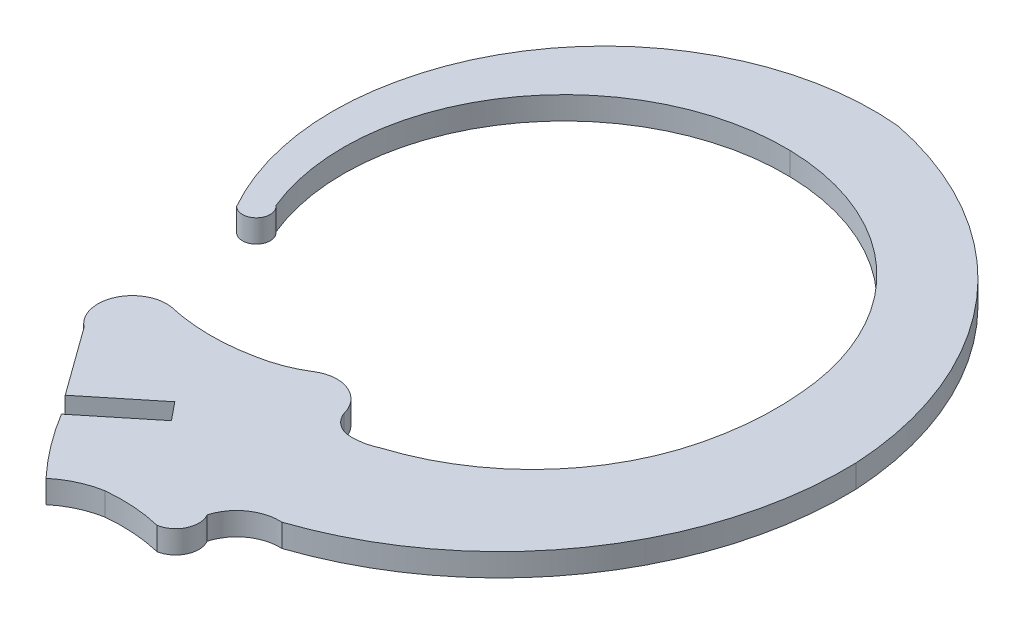
ISO-10303-21;
HEADER;
FILE_DESCRIPTION(('STEP AP214'),'2;1');
FILE_NAME('part.step','',(''),(''),'','','');
FILE_SCHEMA(('AUTOMOTIVE_DESIGN { 1 0 10303 214 1 1 1 1 }'));
ENDSEC;
DATA;
#1=APPLICATION_CONTEXT('core data for automotive mechanical design processes');
#2=APPLICATION_PROTOCOL_DEFINITION('international standard','automotive_design',2000,#1);
#3=PRODUCT_CONTEXT('',#1,'mechanical');
#4=PRODUCT('Part','Part','',(#3));
#5=PRODUCT_RELATED_PRODUCT_CATEGORY('part','',(#4));
#6=PRODUCT_DEFINITION_FORMATION('','',#4);
#7=PRODUCT_DEFINITION_CONTEXT('part definition',#1,'design');
#8=PRODUCT_DEFINITION('design','',#6,#7);
#9=PRODUCT_DEFINITION_SHAPE('','',#8);
#10=(LENGTH_UNIT() NAMED_UNIT(*) SI_UNIT(.MILLI.,.METRE.));
#11=(NAMED_UNIT(*) PLANE_ANGLE_UNIT() SI_UNIT($,.RADIAN.));
#12=(NAMED_UNIT(*) SI_UNIT($,.STERADIAN.) SOLID_ANGLE_UNIT());
#13=UNCERTAINTY_MEASURE_WITH_UNIT(LENGTH_MEASURE(1.E-05),#10,'distance_accuracy_value','');
#14=(GEOMETRIC_REPRESENTATION_CONTEXT(3) GLOBAL_UNCERTAINTY_ASSIGNED_CONTEXT((#13)) GLOBAL_UNIT_ASSIGNED_CONTEXT((#10,
#11,#12)) REPRESENTATION_CONTEXT('',''));
#15=CARTESIAN_POINT('',(0.,0.,0.));
#16=DIRECTION('',(0.,0.,1.));
#17=DIRECTION('',(1.,0.,0.));
#18=AXIS2_PLACEMENT_3D('',#15,#16,#17);
#19=CARTESIAN_POINT('',(141.3229,3.,-61.97529));
#20=DIRECTION('',(-0.63033432014643,0.,-0.776323801545165));
#21=DIRECTION('',(-0.776323801545166,0.,0.630334320146431));
#22=AXIS2_PLACEMENT_3D('',#19,#20,#21);
#23=PLANE('',#22);
#24=DIRECTION('',(0.776323801545165,0.,-0.63033432014643));
#25=VECTOR('',#24,1.);
#26=CARTESIAN_POINT('',(141.3229,0.,-61.97529));
#27=LINE('',#26,#25);
#28=CARTESIAN_POINT('',(133.37894,0.,-55.52521));
#29=VERTEX_POINT('',#28);
#30=CARTESIAN_POINT('',(141.3229,0.,-61.97529));
#31=VERTEX_POINT('',#30);
#32=EDGE_CURVE('E239',#29,#31,#27,.T.);
#33=ORIENTED_EDGE('',*,*,#32,.T.);
#34=DIRECTION('',(0.,-1.,0.));
#35=VECTOR('',#34,1.);
#36=CARTESIAN_POINT('',(141.3229,3.,-61.97529));
#37=LINE('',#36,#35);
#38=CARTESIAN_POINT('',(141.3229,3.,-61.97529));
#39=VERTEX_POINT('',#38);
#40=EDGE_CURVE('E11',#39,#31,#37,.T.);
#41=ORIENTED_EDGE('',*,*,#40,.F.);
#42=DIRECTION('',(0.776323801545165,0.,-0.63033432014643));
#43=VECTOR('',#42,1.);
#44=CARTESIAN_POINT('',(141.3229,3.,-61.97529));
#45=LINE('',#44,#43);
#46=CARTESIAN_POINT('',(133.37894,3.,-55.52521));
#47=VERTEX_POINT('',#46);
#48=EDGE_CURVE('E289',#47,#39,#45,.T.);
#49=ORIENTED_EDGE('',*,*,#48,.F.);
#50=DIRECTION('',(0.,-1.,0.));
#51=VECTOR('',#50,1.);
#52=CARTESIAN_POINT('',(133.37894,3.,-55.52521));
#53=LINE('',#52,#51);
#54=EDGE_CURVE('E235',#47,#29,#53,.T.);
#55=ORIENTED_EDGE('',*,*,#54,.T.);
#56=EDGE_LOOP('',(#33,#41,#49,#55));
#57=FACE_BOUND('',#56,.T.);
#58=ADVANCED_FACE('F35',(#57),#23,.F.);
#59=CARTESIAN_POINT('',(143.25429,3.,-59.59579));
#60=DIRECTION('',(0.776425907353547,0.,-0.630208545158046));
#61=DIRECTION('',(-0.630208545158046,0.,-0.776425907353547));
#62=AXIS2_PLACEMENT_3D('',#59,#60,#61);
#63=PLANE('',#62);
#64=DIRECTION('',(0.630208545158046,0.,0.776425907353547));
#65=VECTOR('',#64,1.);
#66=CARTESIAN_POINT('',(143.25429,0.,-59.59579));
#67=LINE('',#66,#65);
#68=CARTESIAN_POINT('',(143.25429,0.,-59.59579));
#69=VERTEX_POINT('',#68);
#70=EDGE_CURVE('E242',#31,#69,#67,.T.);
#71=ORIENTED_EDGE('',*,*,#70,.T.);
#72=DIRECTION('',(0.,-1.,0.));
#73=VECTOR('',#72,1.);
#74=CARTESIAN_POINT('',(143.25429,3.,-59.59579));
#75=LINE('',#74,#73);
#76=CARTESIAN_POINT('',(143.25429,3.,-59.59579));
#77=VERTEX_POINT('',#76);
#78=EDGE_CURVE('E43',#77,#69,#75,.T.);
#79=ORIENTED_EDGE('',*,*,#78,.F.);
#80=DIRECTION('',(0.630208545158046,0.,0.776425907353547));
#81=VECTOR('',#80,1.);
#82=CARTESIAN_POINT('',(143.25429,3.,-59.59579));
#83=LINE('',#82,#81);
#84=EDGE_CURVE('E148',#39,#77,#83,.T.);
#85=ORIENTED_EDGE('',*,*,#84,.F.);
#86=ORIENTED_EDGE('',*,*,#40,.T.);
#87=EDGE_LOOP('',(#71,#79,#85,#86));
#88=FACE_BOUND('',#87,.T.);
#89=ADVANCED_FACE('F437',(#88),#63,.F.);
#90=CARTESIAN_POINT('',(135.27973999998,3.,-53.1224799999469));
#91=DIRECTION('',(0.630239993947959,0.,0.77640037997703));
#92=DIRECTION('',(0.77640037997703,0.,-0.630239993947959));
#93=AXIS2_PLACEMENT_3D('',#90,#91,#92);
#94=PLANE('',#93);
#95=DIRECTION('',(-0.77640037997703,0.,0.630239993947959));
#96=VECTOR('',#95,1.);
#97=CARTESIAN_POINT('',(135.27973999998,0.,-53.1224799999469));
#98=LINE('',#97,#96);
#99=CARTESIAN_POINT('',(135.27973999998,0.,-53.1224799999469));
#100=VERTEX_POINT('',#99);
#101=EDGE_CURVE('E244',#69,#100,#98,.T.);
#102=ORIENTED_EDGE('',*,*,#101,.T.);
#103=DIRECTION('',(0.,-1.,0.));
#104=VECTOR('',#103,1.);
#105=CARTESIAN_POINT('',(135.27973999998,3.,-53.1224799999469));
#106=LINE('',#105,#104);
#107=CARTESIAN_POINT('',(135.27973999998,3.,-53.1224799999469));
#108=VERTEX_POINT('',#107);
#109=EDGE_CURVE('E350',#108,#100,#106,.T.);
#110=ORIENTED_EDGE('',*,*,#109,.F.);
#111=DIRECTION('',(-0.77640037997703,0.,0.630239993947959));
#112=VECTOR('',#111,1.);
#113=CARTESIAN_POINT('',(135.27973999998,3.,-53.1224799999469));
#114=LINE('',#113,#112);
#115=EDGE_CURVE('E358',#77,#108,#114,.T.);
#116=ORIENTED_EDGE('',*,*,#115,.F.);
#117=ORIENTED_EDGE('',*,*,#78,.T.);
#118=EDGE_LOOP('',(#102,#110,#116,#117));
#119=FACE_BOUND('',#118,.T.);
#120=ADVANCED_FACE('F356',(#119),#94,.F.);
#121=CARTESIAN_POINT('',(178.514744652899,3.,-79.297487066962));
#122=DIRECTION('',(0.,-1.,0.));
#123=DIRECTION('',(0.,0.,-1.));
#124=AXIS2_PLACEMENT_3D('',#121,#122,#123);
#125=CYLINDRICAL_SURFACE('',#124,50.5410389910634);
#126=CARTESIAN_POINT('',(178.514744652899,0.,-79.297487066962));
#127=DIRECTION('',(0.,1.,0.));
#128=DIRECTION('',(0.,0.,1.));
#129=AXIS2_PLACEMENT_3D('',#126,#127,#128);
#130=CIRCLE('',#129,50.5410389910634);
#131=CARTESIAN_POINT('',(141.571160000029,0.,-44.8073700000046));
#132=VERTEX_POINT('',#131);
#133=EDGE_CURVE('E246',#100,#132,#130,.T.);
#134=ORIENTED_EDGE('',*,*,#133,.T.);
#135=DIRECTION('',(0.,-1.,0.));
#136=VECTOR('',#135,1.);
#137=CARTESIAN_POINT('',(141.571160000029,3.,-44.8073700000046));
#138=LINE('',#137,#136);
#139=CARTESIAN_POINT('',(141.571160000029,3.,-44.8073700000046));
#140=VERTEX_POINT('',#139);
#141=EDGE_CURVE('E347',#140,#132,#138,.T.);
#142=ORIENTED_EDGE('',*,*,#141,.F.);
#143=CARTESIAN_POINT('',(178.514744652899,3.,-79.297487066962));
#144=DIRECTION('',(0.,1.,0.));
#145=DIRECTION('',(0.,0.,1.));
#146=AXIS2_PLACEMENT_3D('',#143,#144,#145);
#147=CIRCLE('',#146,50.5410389910634);
#148=EDGE_CURVE('E376',#108,#140,#147,.T.);
#149=ORIENTED_EDGE('',*,*,#148,.F.);
#150=ORIENTED_EDGE('',*,*,#109,.T.);
#151=EDGE_LOOP('',(#134,#142,#149,#150));
#152=FACE_BOUND('',#151,.T.);
#153=ADVANCED_FACE('F367',(#152),#125,.T.);
#154=CARTESIAN_POINT('',(148.778263669927,3.,-36.2116017067342));
#155=DIRECTION('',(0.,-1.,0.));
#156=DIRECTION('',(0.,0.,-1.));
#157=AXIS2_PLACEMENT_3D('',#154,#155,#156);
#158=CYLINDRICAL_SURFACE('',#157,11.2173782971);
#159=CARTESIAN_POINT('',(148.778263669927,0.,-36.2116017067342));
#160=DIRECTION('',(0.,-1.,0.));
#161=DIRECTION('',(0.,0.,1.));
#162=AXIS2_PLACEMENT_3D('',#159,#160,#161);
#163=CIRCLE('',#162,11.2173782971);
#164=CARTESIAN_POINT('',(146.848320000081,0.,-47.2617099999353));
#165=VERTEX_POINT('',#164);
#166=EDGE_CURVE('E248',#132,#165,#163,.T.);
#167=ORIENTED_EDGE('',*,*,#166,.T.);
#168=DIRECTION('',(0.,-1.,0.));
#169=VECTOR('',#168,1.);
#170=CARTESIAN_POINT('',(146.848320000081,3.,-47.2617099999353));
#171=LINE('',#170,#169);
#172=CARTESIAN_POINT('',(146.848320000081,3.,-47.2617099999353));
#173=VERTEX_POINT('',#172);
#174=EDGE_CURVE('E344',#173,#165,#171,.T.);
#175=ORIENTED_EDGE('',*,*,#174,.F.);
#176=CARTESIAN_POINT('',(148.778263669927,3.,-36.2116017067342));
#177=DIRECTION('',(0.,-1.,0.));
#178=DIRECTION('',(0.,0.,1.));
#179=AXIS2_PLACEMENT_3D('',#176,#177,#178);
#180=CIRCLE('',#179,11.2173782971);
#181=EDGE_CURVE('E373',#140,#173,#180,.T.);
#182=ORIENTED_EDGE('',*,*,#181,.F.);
#183=ORIENTED_EDGE('',*,*,#141,.T.);
#184=EDGE_LOOP('',(#167,#175,#182,#183));
#185=FACE_BOUND('',#184,.T.);
#186=ADVANCED_FACE('F371',(#185),#158,.F.);
#187=CARTESIAN_POINT('',(149.035695842551,3.,-25.4804409807381));
#188=DIRECTION('',(0.,-1.,0.));
#189=DIRECTION('',(0.,0.,-1.));
#190=AXIS2_PLACEMENT_3D('',#187,#188,#189);
#191=CYLINDRICAL_SURFACE('',#190,21.8908266898);
#192=CARTESIAN_POINT('',(149.035695842551,0.,-25.4804409807381));
#193=DIRECTION('',(0.,-1.,0.));
#194=DIRECTION('',(0.,0.,1.));
#195=AXIS2_PLACEMENT_3D('',#192,#193,#194);
#196=CIRCLE('',#195,21.8908266898);
#197=CARTESIAN_POINT('',(154.205630000007,0.,-46.7520199999466));
#198=VERTEX_POINT('',#197);
#199=EDGE_CURVE('E250',#165,#198,#196,.T.);
#200=ORIENTED_EDGE('',*,*,#199,.T.);
#201=DIRECTION('',(0.,-1.,0.));
#202=VECTOR('',#201,1.);
#203=CARTESIAN_POINT('',(154.205630000007,3.,-46.7520199999466));
#204=LINE('',#203,#202);
#205=CARTESIAN_POINT('',(154.205630000007,3.,-46.7520199999466));
#206=VERTEX_POINT('',#205);
#207=EDGE_CURVE('E341',#206,#198,#204,.T.);
#208=ORIENTED_EDGE('',*,*,#207,.F.);
#209=CARTESIAN_POINT('',(149.035695842551,3.,-25.4804409807381));
#210=DIRECTION('',(0.,-1.,0.));
#211=DIRECTION('',(0.,0.,1.));
#212=AXIS2_PLACEMENT_3D('',#209,#210,#211);
#213=CIRCLE('',#212,21.8908266898);
#214=EDGE_CURVE('E375',#173,#206,#213,.T.);
#215=ORIENTED_EDGE('',*,*,#214,.F.);
#216=ORIENTED_EDGE('',*,*,#174,.T.);
#217=EDGE_LOOP('',(#200,#208,#215,#216));
#218=FACE_BOUND('',#217,.T.);
#219=ADVANCED_FACE('F450',(#218),#191,.F.);
#220=CARTESIAN_POINT('',(153.675678134344,3.,-49.7399960232772));
#221=DIRECTION('',(0.,-1.,0.));
#222=DIRECTION('',(0.,0.,-1.));
#223=AXIS2_PLACEMENT_3D('',#220,#221,#222);
#224=CYLINDRICAL_SURFACE('',#223,3.03460865613962);
#225=CARTESIAN_POINT('',(153.675678134344,0.,-49.7399960232772));
#226=DIRECTION('',(0.,1.,0.));
#227=DIRECTION('',(0.,0.,1.));
#228=AXIS2_PLACEMENT_3D('',#225,#226,#227);
#229=CIRCLE('',#228,3.03460865613962);
#230=CARTESIAN_POINT('',(156.312290000013,0.,-51.2423699999325));
#231=VERTEX_POINT('',#230);
#232=EDGE_CURVE('E252',#198,#231,#229,.T.);
#233=ORIENTED_EDGE('',*,*,#232,.T.);
#234=DIRECTION('',(0.,-1.,0.));
#235=VECTOR('',#234,1.);
#236=CARTESIAN_POINT('',(156.312290000013,3.,-51.2423699999325));
#237=LINE('',#236,#235);
#238=CARTESIAN_POINT('',(156.312290000013,3.,-51.2423699999325));
#239=VERTEX_POINT('',#238);
#240=EDGE_CURVE('E338',#239,#231,#237,.T.);
#241=ORIENTED_EDGE('',*,*,#240,.F.);
#242=CARTESIAN_POINT('',(153.675678134344,3.,-49.7399960232772));
#243=DIRECTION('',(0.,1.,0.));
#244=DIRECTION('',(0.,0.,1.));
#245=AXIS2_PLACEMENT_3D('',#242,#243,#244);
#246=CIRCLE('',#245,3.03460865613962);
#247=EDGE_CURVE('E378',#206,#239,#246,.T.);
#248=ORIENTED_EDGE('',*,*,#247,.F.);
#249=ORIENTED_EDGE('',*,*,#207,.T.);
#250=EDGE_LOOP('',(#233,#241,#248,#249));
#251=FACE_BOUND('',#250,.T.);
#252=ADVANCED_FACE('F453',(#251),#224,.T.);
#253=CARTESIAN_POINT('',(161.740328152736,3.,-49.6722486888493));
#254=DIRECTION('',(0.,-1.,0.));
#255=DIRECTION('',(0.,0.,-1.));
#256=AXIS2_PLACEMENT_3D('',#253,#254,#255);
#257=CYLINDRICAL_SURFACE('',#256,5.6505644956);
#258=CARTESIAN_POINT('',(161.740328152736,0.,-49.6722486888493));
#259=DIRECTION('',(0.,-1.,0.));
#260=DIRECTION('',(0.,0.,1.));
#261=AXIS2_PLACEMENT_3D('',#258,#259,#260);
#262=CIRCLE('',#261,5.6505644956);
#263=CARTESIAN_POINT('',(162.049110000062,0.,-55.3143699999961));
#264=VERTEX_POINT('',#263);
#265=EDGE_CURVE('E254',#231,#264,#262,.T.);
#266=ORIENTED_EDGE('',*,*,#265,.T.);
#267=DIRECTION('',(0.,-1.,0.));
#268=VECTOR('',#267,1.);
#269=CARTESIAN_POINT('',(162.049110000062,3.,-55.3143699999961));
#270=LINE('',#269,#268);
#271=CARTESIAN_POINT('',(162.049110000062,3.,-55.3143699999961));
#272=VERTEX_POINT('',#271);
#273=EDGE_CURVE('E335',#272,#264,#270,.T.);
#274=ORIENTED_EDGE('',*,*,#273,.F.);
#275=CARTESIAN_POINT('',(161.740328152736,3.,-49.6722486888493));
#276=DIRECTION('',(0.,-1.,0.));
#277=DIRECTION('',(0.,0.,1.));
#278=AXIS2_PLACEMENT_3D('',#275,#276,#277);
#279=CIRCLE('',#278,5.6505644956);
#280=EDGE_CURVE('E384',#239,#272,#279,.T.);
#281=ORIENTED_EDGE('',*,*,#280,.F.);
#282=ORIENTED_EDGE('',*,*,#240,.T.);
#283=EDGE_LOOP('',(#266,#274,#281,#282));
#284=FACE_BOUND('',#283,.T.);
#285=ADVANCED_FACE('F457',(#284),#257,.F.);
#286=CARTESIAN_POINT('',(147.523516574409,3.,-98.4431050820576));
#287=DIRECTION('',(0.,-1.,0.));
#288=DIRECTION('',(0.,0.,-1.));
#289=AXIS2_PLACEMENT_3D('',#286,#287,#288);
#290=CYLINDRICAL_SURFACE('',#289,45.5091271521);
#291=CARTESIAN_POINT('',(147.523516574409,0.,-98.4431050820576));
#292=DIRECTION('',(0.,1.,0.));
#293=DIRECTION('',(0.,0.,1.));
#294=AXIS2_PLACEMENT_3D('',#291,#292,#293);
#295=CIRCLE('',#294,45.5091271521);
#296=CARTESIAN_POINT('',(193.013370000028,0.,-99.7674500000169));
#297=VERTEX_POINT('',#296);
#298=EDGE_CURVE('E256',#264,#297,#295,.T.);
#299=ORIENTED_EDGE('',*,*,#298,.T.);
#300=DIRECTION('',(0.,-1.,0.));
#301=VECTOR('',#300,1.);
#302=CARTESIAN_POINT('',(193.013370000028,3.,-99.7674500000169));
#303=LINE('',#302,#301);
#304=CARTESIAN_POINT('',(193.013370000028,3.,-99.7674500000169));
#305=VERTEX_POINT('',#304);
#306=EDGE_CURVE('E332',#305,#297,#303,.T.);
#307=ORIENTED_EDGE('',*,*,#306,.F.);
#308=CARTESIAN_POINT('',(147.523516574409,3.,-98.4431050820576));
#309=DIRECTION('',(0.,1.,0.));
#310=DIRECTION('',(0.,0.,1.));
#311=AXIS2_PLACEMENT_3D('',#308,#309,#310);
#312=CIRCLE('',#311,45.5091271521);
#313=EDGE_CURVE('E386',#272,#305,#312,.T.);
#314=ORIENTED_EDGE('',*,*,#313,.F.);
#315=ORIENTED_EDGE('',*,*,#273,.T.);
#316=EDGE_LOOP('',(#299,#307,#314,#315));
#317=FACE_BOUND('',#316,.T.);
#318=ADVANCED_FACE('F461',(#317),#290,.T.);
#319=CARTESIAN_POINT('',(148.693038754421,3.,-97.3202614375352));
#320=DIRECTION('',(0.,-1.,0.));
#321=DIRECTION('',(0.,0.,-1.));
#322=AXIS2_PLACEMENT_3D('',#319,#320,#321);
#323=CYLINDRICAL_SURFACE('',#322,44.3878417315);
#324=CARTESIAN_POINT('',(148.693038754421,0.,-97.3202614375352));
#325=DIRECTION('',(0.,1.,0.));
#326=DIRECTION('',(0.,0.,1.));
#327=AXIS2_PLACEMENT_3D('',#324,#325,#326);
#328=CIRCLE('',#327,44.3878417315);
#329=CARTESIAN_POINT('',(157.423129999921,0.,-140.841129999938));
#330=VERTEX_POINT('',#329);
#331=EDGE_CURVE('E258',#297,#330,#328,.T.);
#332=ORIENTED_EDGE('',*,*,#331,.T.);
#333=DIRECTION('',(0.,-1.,0.));
#334=VECTOR('',#333,1.);
#335=CARTESIAN_POINT('',(157.423129999921,3.,-140.841129999938));
#336=LINE('',#335,#334);
#337=CARTESIAN_POINT('',(157.423129999921,3.,-140.841129999938));
#338=VERTEX_POINT('',#337);
#339=EDGE_CURVE('E329',#338,#330,#336,.T.);
#340=ORIENTED_EDGE('',*,*,#339,.F.);
#341=CARTESIAN_POINT('',(148.693038754421,3.,-97.3202614375352));
#342=DIRECTION('',(0.,1.,0.));
#343=DIRECTION('',(0.,0.,1.));
#344=AXIS2_PLACEMENT_3D('',#341,#342,#343);
#345=CIRCLE('',#344,44.3878417315);
#346=EDGE_CURVE('E388',#305,#338,#345,.T.);
#347=ORIENTED_EDGE('',*,*,#346,.F.);
#348=ORIENTED_EDGE('',*,*,#306,.T.);
#349=EDGE_LOOP('',(#332,#340,#347,#348));
#350=FACE_BOUND('',#349,.T.);
#351=ADVANCED_FACE('F465',(#350),#323,.T.);
#352=CARTESIAN_POINT('',(154.076220227908,3.,-105.627310166853));
#353=DIRECTION('',(0.,-1.,0.));
#354=DIRECTION('',(0.,0.,-1.));
#355=AXIS2_PLACEMENT_3D('',#352,#353,#354);
#356=CYLINDRICAL_SURFACE('',#355,35.3725163405);
#357=CARTESIAN_POINT('',(154.076220227908,0.,-105.627310166853));
#358=DIRECTION('',(0.,1.,0.));
#359=DIRECTION('',(0.,0.,1.));
#360=AXIS2_PLACEMENT_3D('',#357,#358,#359);
#361=CIRCLE('',#360,35.3725163405);
#362=CARTESIAN_POINT('',(119.496370000009,0.,-113.073709999995));
#363=VERTEX_POINT('',#362);
#364=EDGE_CURVE('E260',#330,#363,#361,.T.);
#365=ORIENTED_EDGE('',*,*,#364,.T.);
#366=DIRECTION('',(0.,-1.,0.));
#367=VECTOR('',#366,1.);
#368=CARTESIAN_POINT('',(119.496370000009,3.,-113.073709999995));
#369=LINE('',#368,#367);
#370=CARTESIAN_POINT('',(119.496370000009,3.,-113.073709999995));
#371=VERTEX_POINT('',#370);
#372=EDGE_CURVE('E326',#371,#363,#369,.T.);
#373=ORIENTED_EDGE('',*,*,#372,.F.);
#374=CARTESIAN_POINT('',(154.076220227908,3.,-105.627310166853));
#375=DIRECTION('',(0.,1.,0.));
#376=DIRECTION('',(0.,0.,1.));
#377=AXIS2_PLACEMENT_3D('',#374,#375,#376);
#378=CIRCLE('',#377,35.3725163405);
#379=EDGE_CURVE('E390',#338,#371,#378,.T.);
#380=ORIENTED_EDGE('',*,*,#379,.F.);
#381=ORIENTED_EDGE('',*,*,#339,.T.);
#382=EDGE_LOOP('',(#365,#373,#380,#381));
#383=FACE_BOUND('',#382,.T.);
#384=ADVANCED_FACE('F469',(#383),#356,.T.);
#385=CARTESIAN_POINT('',(153.463000137854,3.,-105.405829064778));
#386=DIRECTION('',(0.,-1.,0.));
#387=DIRECTION('',(0.,0.,-1.));
#388=AXIS2_PLACEMENT_3D('',#385,#386,#387);
#389=CYLINDRICAL_SURFACE('',#388,34.8213779302);
#390=CARTESIAN_POINT('',(153.463000137854,0.,-105.405829064778));
#391=DIRECTION('',(0.,1.,0.));
#392=DIRECTION('',(0.,0.,1.));
#393=AXIS2_PLACEMENT_3D('',#390,#391,#392);
#394=CIRCLE('',#393,34.8213779302);
#395=CARTESIAN_POINT('',(123.152899999939,0.,-88.2644700000079));
#396=VERTEX_POINT('',#395);
#397=EDGE_CURVE('E262',#363,#396,#394,.T.);
#398=ORIENTED_EDGE('',*,*,#397,.T.);
#399=DIRECTION('',(0.,-1.,0.));
#400=VECTOR('',#399,1.);
#401=CARTESIAN_POINT('',(123.152899999939,3.,-88.2644700000079));
#402=LINE('',#401,#400);
#403=CARTESIAN_POINT('',(123.152899999939,3.,-88.2644700000079));
#404=VERTEX_POINT('',#403);
#405=EDGE_CURVE('E323',#404,#396,#402,.T.);
#406=ORIENTED_EDGE('',*,*,#405,.F.);
#407=CARTESIAN_POINT('',(153.463000137854,3.,-105.405829064778));
#408=DIRECTION('',(0.,1.,0.));
#409=DIRECTION('',(0.,0.,1.));
#410=AXIS2_PLACEMENT_3D('',#407,#408,#409);
#411=CIRCLE('',#410,34.8213779302);
#412=EDGE_CURVE('E392',#371,#404,#411,.T.);
#413=ORIENTED_EDGE('',*,*,#412,.F.);
#414=ORIENTED_EDGE('',*,*,#372,.T.);
#415=EDGE_LOOP('',(#398,#406,#413,#414));
#416=FACE_BOUND('',#415,.T.);
#417=ADVANCED_FACE('F473',(#416),#389,.T.);
#418=CARTESIAN_POINT('',(124.460105982563,3.,-89.541995717178));
#419=DIRECTION('',(0.,-1.,0.));
#420=DIRECTION('',(0.,0.,-1.));
#421=AXIS2_PLACEMENT_3D('',#418,#419,#420);
#422=CYLINDRICAL_SURFACE('',#421,1.82780180518522);
#423=CARTESIAN_POINT('',(124.460105982563,0.,-89.541995717178));
#424=DIRECTION('',(0.,1.,0.));
#425=DIRECTION('',(0.,0.,1.));
#426=AXIS2_PLACEMENT_3D('',#423,#424,#425);
#427=CIRCLE('',#426,1.82780180518522);
#428=CARTESIAN_POINT('',(125.651529999958,0.,-90.928129999927));
#429=VERTEX_POINT('',#428);
#430=EDGE_CURVE('E264',#396,#429,#427,.T.);
#431=ORIENTED_EDGE('',*,*,#430,.T.);
#432=DIRECTION('',(0.,-1.,0.));
#433=VECTOR('',#432,1.);
#434=CARTESIAN_POINT('',(125.651529999958,3.,-90.928129999927));
#435=LINE('',#434,#433);
#436=CARTESIAN_POINT('',(125.651529999958,3.,-90.928129999927));
#437=VERTEX_POINT('',#436);
#438=EDGE_CURVE('E320',#437,#429,#435,.T.);
#439=ORIENTED_EDGE('',*,*,#438,.F.);
#440=CARTESIAN_POINT('',(124.460105982563,3.,-89.541995717178));
#441=DIRECTION('',(0.,1.,0.));
#442=DIRECTION('',(0.,0.,1.));
#443=AXIS2_PLACEMENT_3D('',#440,#441,#442);
#444=CIRCLE('',#443,1.82780180518522);
#445=EDGE_CURVE('E394',#404,#437,#444,.T.);
#446=ORIENTED_EDGE('',*,*,#445,.F.);
#447=ORIENTED_EDGE('',*,*,#405,.T.);
#448=EDGE_LOOP('',(#431,#439,#446,#447));
#449=FACE_BOUND('',#448,.T.);
#450=ADVANCED_FACE('F477',(#449),#422,.T.);
#451=CARTESIAN_POINT('',(152.447452217334,3.,-101.981433225897));
#452=DIRECTION('',(0.,-1.,0.));
#453=DIRECTION('',(0.,0.,-1.));
#454=AXIS2_PLACEMENT_3D('',#451,#452,#453);
#455=CYLINDRICAL_SURFACE('',#454,28.9861511706);
#456=CARTESIAN_POINT('',(152.447452217334,0.,-101.981433225897));
#457=DIRECTION('',(0.,-1.,0.));
#458=DIRECTION('',(0.,0.,1.));
#459=AXIS2_PLACEMENT_3D('',#456,#457,#458);
#460=CIRCLE('',#459,28.9861511706);
#461=CARTESIAN_POINT('',(153.165469999998,0.,-130.958689999937));
#462=VERTEX_POINT('',#461);
#463=EDGE_CURVE('E266',#429,#462,#460,.T.);
#464=ORIENTED_EDGE('',*,*,#463,.T.);
#465=DIRECTION('',(0.,-1.,0.));
#466=VECTOR('',#465,1.);
#467=CARTESIAN_POINT('',(153.165469999998,3.,-130.958689999937));
#468=LINE('',#467,#466);
#469=CARTESIAN_POINT('',(153.165469999998,3.,-130.958689999937));
#470=VERTEX_POINT('',#469);
#471=EDGE_CURVE('E317',#470,#462,#468,.T.);
#472=ORIENTED_EDGE('',*,*,#471,.F.);
#473=CARTESIAN_POINT('',(152.447452217334,3.,-101.981433225897));
#474=DIRECTION('',(0.,-1.,0.));
#475=DIRECTION('',(0.,0.,1.));
#476=AXIS2_PLACEMENT_3D('',#473,#474,#475);
#477=CIRCLE('',#476,28.9861511706);
#478=EDGE_CURVE('E396',#437,#470,#477,.T.);
#479=ORIENTED_EDGE('',*,*,#478,.F.);
#480=ORIENTED_EDGE('',*,*,#438,.T.);
#481=EDGE_LOOP('',(#464,#472,#479,#480));
#482=FACE_BOUND('',#481,.T.);
#483=ADVANCED_FACE('F481',(#482),#455,.F.);
#484=CARTESIAN_POINT('',(152.588398020329,3.,-102.092021088258));
#485=DIRECTION('',(0.,-1.,0.));
#486=DIRECTION('',(0.,0.,-1.));
#487=AXIS2_PLACEMENT_3D('',#484,#485,#486);
#488=CYLINDRICAL_SURFACE('',#487,28.8724364425);
#489=CARTESIAN_POINT('',(152.588398020329,0.,-102.092021088258));
#490=DIRECTION('',(0.,-1.,0.));
#491=DIRECTION('',(0.,0.,1.));
#492=AXIS2_PLACEMENT_3D('',#489,#490,#491);
#493=CIRCLE('',#492,28.8724364425);
#494=CARTESIAN_POINT('',(176.651740000047,0.,-118.047369999935));
#495=VERTEX_POINT('',#494);
#496=EDGE_CURVE('E268',#462,#495,#493,.T.);
#497=ORIENTED_EDGE('',*,*,#496,.T.);
#498=DIRECTION('',(0.,-1.,0.));
#499=VECTOR('',#498,1.);
#500=CARTESIAN_POINT('',(176.651740000047,3.,-118.047369999935));
#501=LINE('',#500,#499);
#502=CARTESIAN_POINT('',(176.651740000047,3.,-118.047369999935));
#503=VERTEX_POINT('',#502);
#504=EDGE_CURVE('E314',#503,#495,#501,.T.);
#505=ORIENTED_EDGE('',*,*,#504,.F.);
#506=CARTESIAN_POINT('',(152.588398020329,3.,-102.092021088258));
#507=DIRECTION('',(0.,-1.,0.));
#508=DIRECTION('',(0.,0.,1.));
#509=AXIS2_PLACEMENT_3D('',#506,#507,#508);
#510=CIRCLE('',#509,28.8724364425);
#511=EDGE_CURVE('E398',#470,#503,#510,.T.);
#512=ORIENTED_EDGE('',*,*,#511,.F.);
#513=ORIENTED_EDGE('',*,*,#471,.T.);
#514=EDGE_LOOP('',(#497,#505,#512,#513));
#515=FACE_BOUND('',#514,.T.);
#516=ADVANCED_FACE('F485',(#515),#488,.F.);
#517=CARTESIAN_POINT('',(152.047707507843,3.,-101.842557270158));
#518=DIRECTION('',(0.,-1.,0.));
#519=DIRECTION('',(0.,0.,-1.));
#520=AXIS2_PLACEMENT_3D('',#517,#518,#519);
#521=CYLINDRICAL_SURFACE('',#520,29.4610653318);
#522=CARTESIAN_POINT('',(152.047707507843,0.,-101.842557270158));
#523=DIRECTION('',(0.,-1.,0.));
#524=DIRECTION('',(0.,0.,1.));
#525=AXIS2_PLACEMENT_3D('',#522,#523,#524);
#526=CIRCLE('',#525,29.4610653318);
#527=CARTESIAN_POINT('',(181.419049999986,0.,-104.140079999931));
#528=VERTEX_POINT('',#527);
#529=EDGE_CURVE('E270',#495,#528,#526,.T.);
#530=ORIENTED_EDGE('',*,*,#529,.T.);
#531=DIRECTION('',(0.,-1.,0.));
#532=VECTOR('',#531,1.);
#533=CARTESIAN_POINT('',(181.419049999986,3.,-104.140079999931));
#534=LINE('',#533,#532);
#535=CARTESIAN_POINT('',(181.419049999986,3.,-104.140079999931));
#536=VERTEX_POINT('',#535);
#537=EDGE_CURVE('E311',#536,#528,#534,.T.);
#538=ORIENTED_EDGE('',*,*,#537,.F.);
#539=CARTESIAN_POINT('',(152.047707507843,3.,-101.842557270158));
#540=DIRECTION('',(0.,-1.,0.));
#541=DIRECTION('',(0.,0.,1.));
#542=AXIS2_PLACEMENT_3D('',#539,#540,#541);
#543=CIRCLE('',#542,29.4610653318);
#544=EDGE_CURVE('E400',#503,#536,#543,.T.);
#545=ORIENTED_EDGE('',*,*,#544,.F.);
#546=ORIENTED_EDGE('',*,*,#504,.T.);
#547=EDGE_LOOP('',(#530,#538,#545,#546));
#548=FACE_BOUND('',#547,.T.);
#549=ADVANCED_FACE('F489',(#548),#521,.F.);
#550=CARTESIAN_POINT('',(145.201600302232,3.,-100.68502285411));
#551=DIRECTION('',(0.,-1.,0.));
#552=DIRECTION('',(0.,0.,-1.));
#553=AXIS2_PLACEMENT_3D('',#550,#551,#552);
#554=CYLINDRICAL_SURFACE('',#553,36.3818784904);
#555=CARTESIAN_POINT('',(145.201600302232,0.,-100.68502285411));
#556=DIRECTION('',(0.,-1.,0.));
#557=DIRECTION('',(0.,0.,1.));
#558=AXIS2_PLACEMENT_3D('',#555,#556,#557);
#559=CIRCLE('',#558,36.3818784904);
#560=CARTESIAN_POINT('',(179.892730000062,0.,-89.7229699998953));
#561=VERTEX_POINT('',#560);
#562=EDGE_CURVE('E272',#528,#561,#559,.T.);
#563=ORIENTED_EDGE('',*,*,#562,.T.);
#564=DIRECTION('',(0.,-1.,0.));
#565=VECTOR('',#564,1.);
#566=CARTESIAN_POINT('',(179.892730000062,3.,-89.7229699998953));
#567=LINE('',#566,#565);
#568=CARTESIAN_POINT('',(179.892730000062,3.,-89.7229699998953));
#569=VERTEX_POINT('',#568);
#570=EDGE_CURVE('E308',#569,#561,#567,.T.);
#571=ORIENTED_EDGE('',*,*,#570,.F.);
#572=CARTESIAN_POINT('',(145.201600302232,3.,-100.68502285411));
#573=DIRECTION('',(0.,-1.,0.));
#574=DIRECTION('',(0.,0.,1.));
#575=AXIS2_PLACEMENT_3D('',#572,#573,#574);
#576=CIRCLE('',#575,36.3818784904);
#577=EDGE_CURVE('E402',#536,#569,#576,.T.);
#578=ORIENTED_EDGE('',*,*,#577,.F.);
#579=ORIENTED_EDGE('',*,*,#537,.T.);
#580=EDGE_LOOP('',(#563,#571,#578,#579));
#581=FACE_BOUND('',#580,.T.);
#582=ADVANCED_FACE('F493',(#581),#554,.F.);
#583=CARTESIAN_POINT('',(151.011607179655,3.,-99.2663472228991));
#584=DIRECTION('',(0.,-1.,0.));
#585=DIRECTION('',(0.,0.,-1.));
#586=AXIS2_PLACEMENT_3D('',#583,#584,#585);
#587=CYLINDRICAL_SURFACE('',#586,30.4170232631);
#588=CARTESIAN_POINT('',(151.011607179655,0.,-99.2663472228991));
#589=DIRECTION('',(0.,-1.,0.));
#590=DIRECTION('',(0.,0.,1.));
#591=AXIS2_PLACEMENT_3D('',#588,#589,#590);
#592=CIRCLE('',#591,30.4170232631);
#593=CARTESIAN_POINT('',(160.107419999967,0.,-70.2411599999748));
#594=VERTEX_POINT('',#593);
#595=EDGE_CURVE('E274',#561,#594,#592,.T.);
#596=ORIENTED_EDGE('',*,*,#595,.T.);
#597=DIRECTION('',(0.,-1.,0.));
#598=VECTOR('',#597,1.);
#599=CARTESIAN_POINT('',(160.107419999967,3.,-70.2411599999748));
#600=LINE('',#599,#598);
#601=CARTESIAN_POINT('',(160.107419999967,3.,-70.2411599999748));
#602=VERTEX_POINT('',#601);
#603=EDGE_CURVE('E305',#602,#594,#600,.T.);
#604=ORIENTED_EDGE('',*,*,#603,.F.);
#605=CARTESIAN_POINT('',(151.011607179655,3.,-99.2663472228991));
#606=DIRECTION('',(0.,-1.,0.));
#607=DIRECTION('',(0.,0.,1.));
#608=AXIS2_PLACEMENT_3D('',#605,#606,#607);
#609=CIRCLE('',#608,30.4170232631);
#610=EDGE_CURVE('E404',#569,#602,#609,.T.);
#611=ORIENTED_EDGE('',*,*,#610,.F.);
#612=ORIENTED_EDGE('',*,*,#570,.T.);
#613=EDGE_LOOP('',(#596,#604,#611,#612));
#614=FACE_BOUND('',#613,.T.);
#615=ADVANCED_FACE('F497',(#614),#587,.F.);
#616=CARTESIAN_POINT('',(157.07452417409,3.,-76.5756890761018));
#617=DIRECTION('',(0.,-1.,0.));
#618=DIRECTION('',(0.,0.,-1.));
#619=AXIS2_PLACEMENT_3D('',#616,#617,#618);
#620=CYLINDRICAL_SURFACE('',#619,7.02315568009999);
#621=CARTESIAN_POINT('',(157.07452417409,0.,-76.5756890761018));
#622=DIRECTION('',(0.,-1.,0.));
#623=DIRECTION('',(0.,0.,1.));
#624=AXIS2_PLACEMENT_3D('',#621,#622,#623);
#625=CIRCLE('',#624,7.02315568009999);
#626=CARTESIAN_POINT('',(156.150159999974,0.,-69.6136299998995));
#627=VERTEX_POINT('',#626);
#628=EDGE_CURVE('E276',#594,#627,#625,.T.);
#629=ORIENTED_EDGE('',*,*,#628,.T.);
#630=DIRECTION('',(0.,-1.,0.));
#631=VECTOR('',#630,1.);
#632=CARTESIAN_POINT('',(156.150159999974,3.,-69.6136299998995));
#633=LINE('',#632,#631);
#634=CARTESIAN_POINT('',(156.150159999974,3.,-69.6136299998995));
#635=VERTEX_POINT('',#634);
#636=EDGE_CURVE('E302',#635,#627,#633,.T.);
#637=ORIENTED_EDGE('',*,*,#636,.F.);
#638=CARTESIAN_POINT('',(157.07452417409,3.,-76.5756890761018));
#639=DIRECTION('',(0.,-1.,0.));
#640=DIRECTION('',(0.,0.,1.));
#641=AXIS2_PLACEMENT_3D('',#638,#639,#640);
#642=CIRCLE('',#641,7.02315568009999);
#643=EDGE_CURVE('E406',#602,#635,#642,.T.);
#644=ORIENTED_EDGE('',*,*,#643,.F.);
#645=ORIENTED_EDGE('',*,*,#603,.T.);
#646=EDGE_LOOP('',(#629,#637,#644,#645));
#647=FACE_BOUND('',#646,.T.);
#648=ADVANCED_FACE('F501',(#647),#620,.F.);
#649=CARTESIAN_POINT('',(157.023568419481,3.,-72.9985614295398));
#650=DIRECTION('',(0.,-1.,0.));
#651=DIRECTION('',(0.,0.,-1.));
#652=AXIS2_PLACEMENT_3D('',#649,#650,#651);
#653=CYLINDRICAL_SURFACE('',#652,3.4957979133);
#654=CARTESIAN_POINT('',(157.023568419481,0.,-72.9985614295398));
#655=DIRECTION('',(0.,-1.,0.));
#656=DIRECTION('',(0.,0.,1.));
#657=AXIS2_PLACEMENT_3D('',#654,#655,#656);
#658=CIRCLE('',#657,3.4957979133);
#659=CARTESIAN_POINT('',(153.742970000013,0.,-71.7909699999509));
#660=VERTEX_POINT('',#659);
#661=EDGE_CURVE('E278',#627,#660,#658,.T.);
#662=ORIENTED_EDGE('',*,*,#661,.T.);
#663=DIRECTION('',(0.,-1.,0.));
#664=VECTOR('',#663,1.);
#665=CARTESIAN_POINT('',(153.742970000013,3.,-71.7909699999509));
#666=LINE('',#665,#664);
#667=CARTESIAN_POINT('',(153.742970000013,3.,-71.7909699999509));
#668=VERTEX_POINT('',#667);
#669=EDGE_CURVE('E299',#668,#660,#666,.T.);
#670=ORIENTED_EDGE('',*,*,#669,.F.);
#671=CARTESIAN_POINT('',(157.023568419481,3.,-72.9985614295398));
#672=DIRECTION('',(0.,-1.,0.));
#673=DIRECTION('',(0.,0.,1.));
#674=AXIS2_PLACEMENT_3D('',#671,#672,#673);
#675=CIRCLE('',#674,3.4957979133);
#676=EDGE_CURVE('E408',#635,#668,#675,.T.);
#677=ORIENTED_EDGE('',*,*,#676,.F.);
#678=ORIENTED_EDGE('',*,*,#636,.T.);
#679=EDGE_LOOP('',(#662,#670,#677,#678));
#680=FACE_BOUND('',#679,.T.);
#681=ADVANCED_FACE('F505',(#680),#653,.F.);
#682=CARTESIAN_POINT('',(149.328848250208,3.,-70.6687015951585));
#683=DIRECTION('',(0.,-1.,0.));
#684=DIRECTION('',(0.,0.,-1.));
#685=AXIS2_PLACEMENT_3D('',#682,#683,#684);
#686=CYLINDRICAL_SURFACE('',#685,4.55455345720001);
#687=CARTESIAN_POINT('',(149.328848250208,0.,-70.6687015951585));
#688=DIRECTION('',(0.,1.,0.));
#689=DIRECTION('',(0.,0.,1.));
#690=AXIS2_PLACEMENT_3D('',#687,#688,#689);
#691=CIRCLE('',#690,4.55455345720001);
#692=CARTESIAN_POINT('',(150.03931999998,0.,-75.1674999999849));
#693=VERTEX_POINT('',#692);
#694=EDGE_CURVE('E280',#660,#693,#691,.T.);
#695=ORIENTED_EDGE('',*,*,#694,.T.);
#696=DIRECTION('',(0.,-1.,0.));
#697=VECTOR('',#696,1.);
#698=CARTESIAN_POINT('',(150.03931999998,3.,-75.1674999999849));
#699=LINE('',#698,#697);
#700=CARTESIAN_POINT('',(150.03931999998,3.,-75.1674999999849));
#701=VERTEX_POINT('',#700);
#702=EDGE_CURVE('E296',#701,#693,#699,.T.);
#703=ORIENTED_EDGE('',*,*,#702,.F.);
#704=CARTESIAN_POINT('',(149.328848250208,3.,-70.6687015951585));
#705=DIRECTION('',(0.,1.,0.));
#706=DIRECTION('',(0.,0.,1.));
#707=AXIS2_PLACEMENT_3D('',#704,#705,#706);
#708=CIRCLE('',#707,4.55455345720001);
#709=EDGE_CURVE('E410',#668,#701,#708,.T.);
#710=ORIENTED_EDGE('',*,*,#709,.F.);
#711=ORIENTED_EDGE('',*,*,#669,.T.);
#712=EDGE_LOOP('',(#695,#703,#710,#711));
#713=FACE_BOUND('',#712,.T.);
#714=ADVANCED_FACE('F509',(#713),#686,.T.);
#715=CARTESIAN_POINT('',(149.401873340941,3.,-70.802610683399));
#716=DIRECTION('',(0.,-1.,0.));
#717=DIRECTION('',(0.,0.,-1.));
#718=AXIS2_PLACEMENT_3D('',#715,#716,#717);
#719=CYLINDRICAL_SURFACE('',#718,4.41118997427745);
#720=CARTESIAN_POINT('',(149.401873340941,0.,-70.802610683399));
#721=DIRECTION('',(0.,1.,0.));
#722=DIRECTION('',(0.,0.,1.));
#723=AXIS2_PLACEMENT_3D('',#720,#721,#722);
#724=CIRCLE('',#723,4.41118997427745);
#725=CARTESIAN_POINT('',(147.101660000032,0.,-74.5665999999977));
#726=VERTEX_POINT('',#725);
#727=EDGE_CURVE('E282',#693,#726,#724,.T.);
#728=ORIENTED_EDGE('',*,*,#727,.T.);
#729=DIRECTION('',(0.,-1.,0.));
#730=VECTOR('',#729,1.);
#731=CARTESIAN_POINT('',(147.101660000032,3.,-74.5665999999977));
#732=LINE('',#731,#730);
#733=CARTESIAN_POINT('',(147.101660000032,3.,-74.5665999999977));
#734=VERTEX_POINT('',#733);
#735=EDGE_CURVE('E293',#734,#726,#732,.T.);
#736=ORIENTED_EDGE('',*,*,#735,.F.);
#737=CARTESIAN_POINT('',(149.401873340941,3.,-70.802610683399));
#738=DIRECTION('',(0.,1.,0.));
#739=DIRECTION('',(0.,0.,1.));
#740=AXIS2_PLACEMENT_3D('',#737,#738,#739);
#741=CIRCLE('',#740,4.41118997427745);
#742=EDGE_CURVE('E412',#701,#734,#741,.T.);
#743=ORIENTED_EDGE('',*,*,#742,.F.);
#744=ORIENTED_EDGE('',*,*,#702,.T.);
#745=EDGE_LOOP('',(#728,#736,#743,#744));
#746=FACE_BOUND('',#745,.T.);
#747=ADVANCED_FACE('F418',(#746),#719,.T.);
#748=CARTESIAN_POINT('',(138.80457592312,3.,-87.7743522842125));
#749=DIRECTION('',(0.,-1.,0.));
#750=DIRECTION('',(0.,0.,-1.));
#751=AXIS2_PLACEMENT_3D('',#748,#749,#750);
#752=CYLINDRICAL_SURFACE('',#751,15.5976384296);
#753=CARTESIAN_POINT('',(138.80457592312,0.,-87.7743522842125));
#754=DIRECTION('',(0.,-1.,0.));
#755=DIRECTION('',(0.,0.,1.));
#756=AXIS2_PLACEMENT_3D('',#753,#754,#755);
#757=CIRCLE('',#756,15.5976384296);
#758=CARTESIAN_POINT('',(141.524129999993,0.,-72.4156300000022));
#759=VERTEX_POINT('',#758);
#760=EDGE_CURVE('E284',#726,#759,#757,.T.);
#761=ORIENTED_EDGE('',*,*,#760,.T.);
#762=DIRECTION('',(0.,-1.,0.));
#763=VECTOR('',#762,1.);
#764=CARTESIAN_POINT('',(141.524129999993,3.,-72.4156300000022));
#765=LINE('',#764,#763);
#766=CARTESIAN_POINT('',(141.524129999993,3.,-72.4156300000022));
#767=VERTEX_POINT('',#766);
#768=EDGE_CURVE('E230',#767,#759,#765,.T.);
#769=ORIENTED_EDGE('',*,*,#768,.F.);
#770=CARTESIAN_POINT('',(138.80457592312,3.,-87.7743522842125));
#771=DIRECTION('',(0.,-1.,0.));
#772=DIRECTION('',(0.,0.,1.));
#773=AXIS2_PLACEMENT_3D('',#770,#771,#772);
#774=CIRCLE('',#773,15.5976384296);
#775=EDGE_CURVE('E221',#734,#767,#774,.T.);
#776=ORIENTED_EDGE('',*,*,#775,.F.);
#777=ORIENTED_EDGE('',*,*,#735,.T.);
#778=EDGE_LOOP('',(#761,#769,#776,#777));
#779=FACE_BOUND('',#778,.T.);
#780=ADVANCED_FACE('F422',(#779),#752,.F.);
#781=CARTESIAN_POINT('',(136.164457192226,3.,-97.8059800343267));
#782=DIRECTION('',(0.,-1.,0.));
#783=DIRECTION('',(0.,0.,-1.));
#784=AXIS2_PLACEMENT_3D('',#781,#782,#783);
#785=CYLINDRICAL_SURFACE('',#784,25.9498741321);
#786=CARTESIAN_POINT('',(136.164457192226,0.,-97.8059800343267));
#787=DIRECTION('',(0.,-1.,0.));
#788=DIRECTION('',(0.,0.,1.));
#789=AXIS2_PLACEMENT_3D('',#786,#787,#788);
#790=CIRCLE('',#789,25.9498741321);
#791=CARTESIAN_POINT('',(130.186160000015,0.,-72.5541300000534));
#792=VERTEX_POINT('',#791);
#793=EDGE_CURVE('E229',#759,#792,#790,.T.);
#794=ORIENTED_EDGE('',*,*,#793,.T.);
#795=DIRECTION('',(0.,-1.,0.));
#796=VECTOR('',#795,1.);
#797=CARTESIAN_POINT('',(130.186160000015,3.,-72.5541300000534));
#798=LINE('',#797,#796);
#799=CARTESIAN_POINT('',(130.186160000015,3.,-72.5541300000534));
#800=VERTEX_POINT('',#799);
#801=EDGE_CURVE('E226',#800,#792,#798,.T.);
#802=ORIENTED_EDGE('',*,*,#801,.F.);
#803=CARTESIAN_POINT('',(136.164457192226,3.,-97.8059800343267));
#804=DIRECTION('',(0.,-1.,0.));
#805=DIRECTION('',(0.,0.,1.));
#806=AXIS2_PLACEMENT_3D('',#803,#804,#805);
#807=CIRCLE('',#806,25.9498741321);
#808=EDGE_CURVE('E215',#767,#800,#807,.T.);
#809=ORIENTED_EDGE('',*,*,#808,.F.);
#810=ORIENTED_EDGE('',*,*,#768,.T.);
#811=EDGE_LOOP('',(#794,#802,#809,#810));
#812=FACE_BOUND('',#811,.T.);
#813=ADVANCED_FACE('F227',(#812),#785,.F.);
#814=CARTESIAN_POINT('',(129.6515306586,3.,-68.065311619));
#815=DIRECTION('',(0.,-1.,0.));
#816=DIRECTION('',(0.,0.,-1.));
#817=AXIS2_PLACEMENT_3D('',#814,#815,#816);
#818=CYLINDRICAL_SURFACE('',#817,4.52054410340001);
#819=CARTESIAN_POINT('',(129.6515306586,0.,-68.065311619));
#820=DIRECTION('',(0.,1.,0.));
#821=DIRECTION('',(0.,0.,1.));
#822=AXIS2_PLACEMENT_3D('',#819,#820,#821);
#823=CIRCLE('',#822,4.52054410340001);
#824=CARTESIAN_POINT('',(126.900839999991,0.,-64.4779699999976));
#825=VERTEX_POINT('',#824);
#826=EDGE_CURVE('E134',#792,#825,#823,.T.);
#827=ORIENTED_EDGE('',*,*,#826,.T.);
#828=DIRECTION('',(0.,-1.,0.));
#829=VECTOR('',#828,1.);
#830=CARTESIAN_POINT('',(126.900839999991,3.,-64.4779699999976));
#831=LINE('',#830,#829);
#832=CARTESIAN_POINT('',(126.900839999991,3.,-64.4779699999976));
#833=VERTEX_POINT('',#832);
#834=EDGE_CURVE('E231',#833,#825,#831,.T.);
#835=ORIENTED_EDGE('',*,*,#834,.F.);
#836=CARTESIAN_POINT('',(129.6515306586,3.,-68.065311619));
#837=DIRECTION('',(0.,1.,0.));
#838=DIRECTION('',(0.,0.,1.));
#839=AXIS2_PLACEMENT_3D('',#836,#837,#838);
#840=CIRCLE('',#839,4.52054410340001);
#841=EDGE_CURVE('E219',#800,#833,#840,.T.);
#842=ORIENTED_EDGE('',*,*,#841,.F.);
#843=ORIENTED_EDGE('',*,*,#801,.T.);
#844=EDGE_LOOP('',(#827,#835,#842,#843));
#845=FACE_BOUND('',#844,.T.);
#846=ADVANCED_FACE('F233',(#845),#818,.T.);
#847=CARTESIAN_POINT('',(133.37894,3.,-55.52521));
#848=DIRECTION('',(0.810154129304861,0.,-0.586216928082329));
#849=DIRECTION('',(-0.586216928082329,0.,-0.810154129304861));
#850=AXIS2_PLACEMENT_3D('',#847,#848,#849);
#851=PLANE('',#850);
#852=DIRECTION('',(0.586216928082329,0.,0.810154129304861));
#853=VECTOR('',#852,1.);
#854=CARTESIAN_POINT('',(133.37894,0.,-55.52521));
#855=LINE('',#854,#853);
#856=EDGE_CURVE('E140',#825,#29,#855,.T.);
#857=ORIENTED_EDGE('',*,*,#856,.T.);
#858=ORIENTED_EDGE('',*,*,#54,.F.);
#859=DIRECTION('',(0.586216928082329,0.,0.810154129304861));
#860=VECTOR('',#859,1.);
#861=CARTESIAN_POINT('',(133.37894,3.,-55.52521));
#862=LINE('',#861,#860);
#863=EDGE_CURVE('E51',#833,#47,#862,.T.);
#864=ORIENTED_EDGE('',*,*,#863,.F.);
#865=ORIENTED_EDGE('',*,*,#834,.T.);
#866=EDGE_LOOP('',(#857,#858,#864,#865));
#867=FACE_BOUND('',#866,.T.);
#868=ADVANCED_FACE('F426',(#867),#851,.F.);
#869=CARTESIAN_POINT('',(129.6515306586,3.,-68.065311619));
#870=DIRECTION('',(0.,1.,0.));
#871=DIRECTION('',(0.,0.,1.));
#872=AXIS2_PLACEMENT_3D('',#869,#870,#871);
#873=PLANE('',#872);
#874=ORIENTED_EDGE('',*,*,#48,.T.);
#875=ORIENTED_EDGE('',*,*,#84,.T.);
#876=ORIENTED_EDGE('',*,*,#115,.T.);
#877=ORIENTED_EDGE('',*,*,#148,.T.);
#878=ORIENTED_EDGE('',*,*,#181,.T.);
#879=ORIENTED_EDGE('',*,*,#214,.T.);
#880=ORIENTED_EDGE('',*,*,#247,.T.);
#881=ORIENTED_EDGE('',*,*,#280,.T.);
#882=ORIENTED_EDGE('',*,*,#313,.T.);
#883=ORIENTED_EDGE('',*,*,#346,.T.);
#884=ORIENTED_EDGE('',*,*,#379,.T.);
#885=ORIENTED_EDGE('',*,*,#412,.T.);
#886=ORIENTED_EDGE('',*,*,#445,.T.);
#887=ORIENTED_EDGE('',*,*,#478,.T.);
#888=ORIENTED_EDGE('',*,*,#511,.T.);
#889=ORIENTED_EDGE('',*,*,#544,.T.);
#890=ORIENTED_EDGE('',*,*,#577,.T.);
#891=ORIENTED_EDGE('',*,*,#610,.T.);
#892=ORIENTED_EDGE('',*,*,#643,.T.);
#893=ORIENTED_EDGE('',*,*,#676,.T.);
#894=ORIENTED_EDGE('',*,*,#709,.T.);
#895=ORIENTED_EDGE('',*,*,#742,.T.);
#896=ORIENTED_EDGE('',*,*,#775,.T.);
#897=ORIENTED_EDGE('',*,*,#808,.T.);
#898=ORIENTED_EDGE('',*,*,#841,.T.);
#899=ORIENTED_EDGE('',*,*,#863,.T.);
#900=EDGE_LOOP('',(#874,#875,#876,#877,#878,#879,#880,#881,#882,#883,#884,#885,#886,#887,#888,
#889,#890,#891,#892,#893,#894,#895,#896,#897,#898,#899));
#901=FACE_BOUND('',#900,.T.);
#902=ADVANCED_FACE('F217',(#901),#873,.T.);
#903=CARTESIAN_POINT('',(129.6515306586,0.,-68.065311619));
#904=DIRECTION('',(0.,1.,0.));
#905=DIRECTION('',(0.,0.,1.));
#906=AXIS2_PLACEMENT_3D('',#903,#904,#905);
#907=PLANE('',#906);
#908=ORIENTED_EDGE('',*,*,#32,.F.);
#909=ORIENTED_EDGE('',*,*,#856,.F.);
#910=ORIENTED_EDGE('',*,*,#826,.F.);
#911=ORIENTED_EDGE('',*,*,#793,.F.);
#912=ORIENTED_EDGE('',*,*,#760,.F.);
#913=ORIENTED_EDGE('',*,*,#727,.F.);
#914=ORIENTED_EDGE('',*,*,#694,.F.);
#915=ORIENTED_EDGE('',*,*,#661,.F.);
#916=ORIENTED_EDGE('',*,*,#628,.F.);
#917=ORIENTED_EDGE('',*,*,#595,.F.);
#918=ORIENTED_EDGE('',*,*,#562,.F.);
#919=ORIENTED_EDGE('',*,*,#529,.F.);
#920=ORIENTED_EDGE('',*,*,#496,.F.);
#921=ORIENTED_EDGE('',*,*,#463,.F.);
#922=ORIENTED_EDGE('',*,*,#430,.F.);
#923=ORIENTED_EDGE('',*,*,#397,.F.);
#924=ORIENTED_EDGE('',*,*,#364,.F.);
#925=ORIENTED_EDGE('',*,*,#331,.F.);
#926=ORIENTED_EDGE('',*,*,#298,.F.);
#927=ORIENTED_EDGE('',*,*,#265,.F.);
#928=ORIENTED_EDGE('',*,*,#232,.F.);
#929=ORIENTED_EDGE('',*,*,#199,.F.);
#930=ORIENTED_EDGE('',*,*,#166,.F.);
#931=ORIENTED_EDGE('',*,*,#133,.F.);
#932=ORIENTED_EDGE('',*,*,#101,.F.);
#933=ORIENTED_EDGE('',*,*,#70,.F.);
#934=EDGE_LOOP('',(#908,#909,#910,#911,#912,#913,#914,#915,#916,#917,#918,#919,#920,#921,#922,
#923,#924,#925,#926,#927,#928,#929,#930,#931,#932,#933));
#935=FACE_BOUND('',#934,.T.);
#936=ADVANCED_FACE('F362',(#935),#907,.F.);
#937=CLOSED_SHELL('',(#58,#89,#120,#153,#186,#219,#252,#285,#318,#351,#384,#417,#450,#483,#516,
#549,#582,#615,#648,#681,#714,#747,#780,#813,#846,#868,#902,#936));
#938=MANIFOLD_SOLID_BREP('B2',#937);
#939=ADVANCED_BREP_SHAPE_REPRESENTATION('',(#18,#938),#14);
#940=SHAPE_DEFINITION_REPRESENTATION(#9,#939);
ENDSEC;
END-ISO-10303-21;
